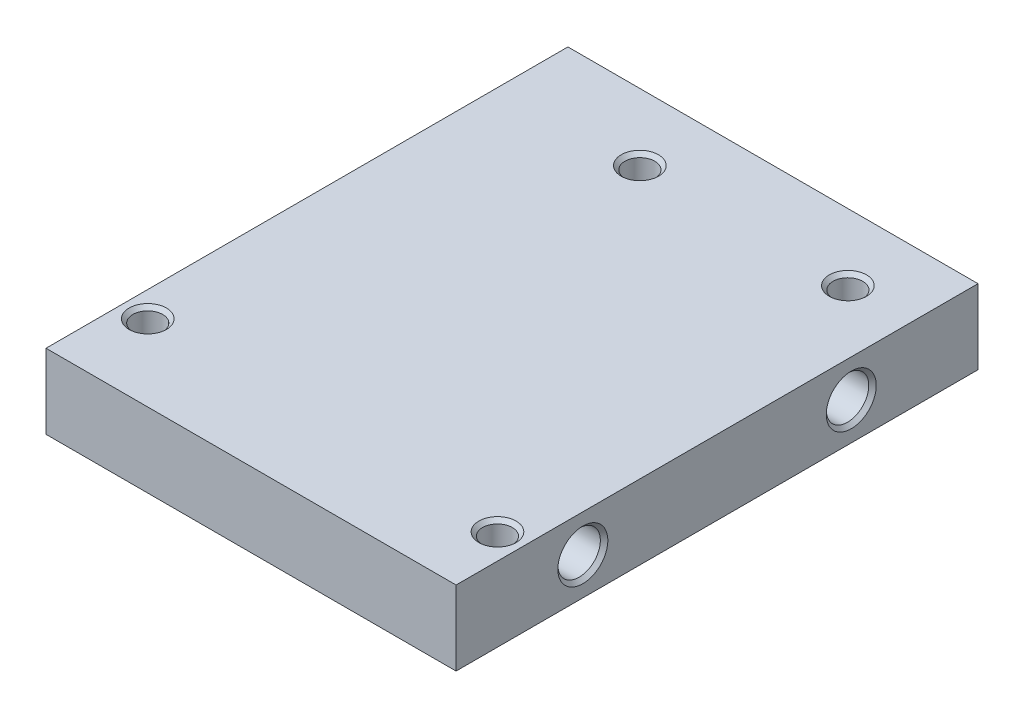
ISO-10303-21;
HEADER;
FILE_DESCRIPTION(('STEP AP214'),'2;1');
FILE_NAME('part.step','',(''),(''),'','','');
FILE_SCHEMA(('AUTOMOTIVE_DESIGN { 1 0 10303 214 1 1 1 1 }'));
ENDSEC;
DATA;
#1=APPLICATION_CONTEXT('core data for automotive mechanical design processes');
#2=APPLICATION_PROTOCOL_DEFINITION('international standard','automotive_design',2000,#1);
#3=PRODUCT_CONTEXT('',#1,'mechanical');
#4=PRODUCT('Part','Part','',(#3));
#5=PRODUCT_RELATED_PRODUCT_CATEGORY('part','',(#4));
#6=PRODUCT_DEFINITION_FORMATION('','',#4);
#7=PRODUCT_DEFINITION_CONTEXT('part definition',#1,'design');
#8=PRODUCT_DEFINITION('design','',#6,#7);
#9=PRODUCT_DEFINITION_SHAPE('','',#8);
#10=(LENGTH_UNIT() NAMED_UNIT(*) SI_UNIT(.MILLI.,.METRE.));
#11=(NAMED_UNIT(*) PLANE_ANGLE_UNIT() SI_UNIT($,.RADIAN.));
#12=(NAMED_UNIT(*) SI_UNIT($,.STERADIAN.) SOLID_ANGLE_UNIT());
#13=UNCERTAINTY_MEASURE_WITH_UNIT(LENGTH_MEASURE(1.E-05),#10,'distance_accuracy_value','');
#14=(GEOMETRIC_REPRESENTATION_CONTEXT(3) GLOBAL_UNCERTAINTY_ASSIGNED_CONTEXT((#13)) GLOBAL_UNIT_ASSIGNED_CONTEXT((#10,
#11,#12)) REPRESENTATION_CONTEXT('',''));
#15=CARTESIAN_POINT('',(0.,0.,0.));
#16=DIRECTION('',(0.,0.,1.));
#17=DIRECTION('',(1.,0.,0.));
#18=AXIS2_PLACEMENT_3D('',#15,#16,#17);
#19=CARTESIAN_POINT('',(0.,5.,0.));
#20=DIRECTION('',(0.,1.,0.));
#21=DIRECTION('',(0.,0.,1.));
#22=AXIS2_PLACEMENT_3D('',#19,#20,#21);
#23=PLANE('',#22);
#24=CARTESIAN_POINT('',(-24.1,5.,24.75));
#25=DIRECTION('',(0.,1.,0.));
#26=DIRECTION('',(0.,0.,1.));
#27=AXIS2_PLACEMENT_3D('',#24,#25,#26);
#28=CIRCLE('',#27,2.5);
#29=CARTESIAN_POINT('',(-24.1,5.,27.25));
#30=VERTEX_POINT('',#29);
#31=EDGE_CURVE('E152',#30,#30,#28,.F.);
#32=ORIENTED_EDGE('',*,*,#31,.T.);
#33=EDGE_LOOP('',(#32));
#34=FACE_BOUND('',#33,.T.);
#35=CARTESIAN_POINT('',(24.1,5.,26.05));
#36=DIRECTION('',(0.,1.,0.));
#37=DIRECTION('',(0.,0.,1.));
#38=AXIS2_PLACEMENT_3D('',#35,#36,#37);
#39=CIRCLE('',#38,2.50000000000001);
#40=CARTESIAN_POINT('',(24.1,5.,28.55));
#41=VERTEX_POINT('',#40);
#42=EDGE_CURVE('E151',#41,#41,#39,.F.);
#43=ORIENTED_EDGE('',*,*,#42,.T.);
#44=EDGE_LOOP('',(#43));
#45=FACE_BOUND('',#44,.T.);
#46=CARTESIAN_POINT('',(19.,5.,-26.05));
#47=DIRECTION('',(0.,1.,0.));
#48=DIRECTION('',(0.,0.,1.));
#49=AXIS2_PLACEMENT_3D('',#46,#47,#48);
#50=CIRCLE('',#49,2.5);
#51=CARTESIAN_POINT('',(19.,5.,-23.55));
#52=VERTEX_POINT('',#51);
#53=EDGE_CURVE('E146',#52,#52,#50,.F.);
#54=ORIENTED_EDGE('',*,*,#53,.T.);
#55=EDGE_LOOP('',(#54));
#56=FACE_BOUND('',#55,.T.);
#57=CARTESIAN_POINT('',(-8.9,5.,-26.05));
#58=DIRECTION('',(0.,1.,0.));
#59=DIRECTION('',(0.,0.,1.));
#60=AXIS2_PLACEMENT_3D('',#57,#58,#59);
#61=CIRCLE('',#60,2.5);
#62=CARTESIAN_POINT('',(-8.9,5.,-23.55));
#63=VERTEX_POINT('',#62);
#64=EDGE_CURVE('E144',#63,#63,#61,.F.);
#65=ORIENTED_EDGE('',*,*,#64,.T.);
#66=EDGE_LOOP('',(#65));
#67=FACE_BOUND('',#66,.T.);
#68=DIRECTION('',(0.,0.,-1.));
#69=VECTOR('',#68,1.);
#70=CARTESIAN_POINT('',(27.5,5.,-35.));
#71=LINE('',#70,#69);
#72=CARTESIAN_POINT('',(27.5,5.,35.));
#73=VERTEX_POINT('',#72);
#74=CARTESIAN_POINT('',(27.5,5.,-35.));
#75=VERTEX_POINT('',#74);
#76=EDGE_CURVE('E91',#73,#75,#71,.T.);
#77=ORIENTED_EDGE('',*,*,#76,.T.);
#78=DIRECTION('',(-1.,0.,0.));
#79=VECTOR('',#78,1.);
#80=CARTESIAN_POINT('',(-27.5,5.,-35.));
#81=LINE('',#80,#79);
#82=CARTESIAN_POINT('',(-27.5,5.,-35.));
#83=VERTEX_POINT('',#82);
#84=EDGE_CURVE('E90',#75,#83,#81,.T.);
#85=ORIENTED_EDGE('',*,*,#84,.T.);
#86=DIRECTION('',(0.,0.,1.));
#87=VECTOR('',#86,1.);
#88=CARTESIAN_POINT('',(-27.5,5.,-35.));
#89=LINE('',#88,#87);
#90=CARTESIAN_POINT('',(-27.5,5.,35.));
#91=VERTEX_POINT('',#90);
#92=EDGE_CURVE('E93',#83,#91,#89,.T.);
#93=ORIENTED_EDGE('',*,*,#92,.T.);
#94=DIRECTION('',(1.,0.,0.));
#95=VECTOR('',#94,1.);
#96=CARTESIAN_POINT('',(-27.5,5.,35.));
#97=LINE('',#96,#95);
#98=EDGE_CURVE('E59',#91,#73,#97,.T.);
#99=ORIENTED_EDGE('',*,*,#98,.T.);
#100=EDGE_LOOP('',(#77,#85,#93,#99));
#101=FACE_BOUND('',#100,.T.);
#102=ADVANCED_FACE('F37',(#34,#45,#56,#67,#101),#23,.T.);
#103=CARTESIAN_POINT('',(0.,-5.,0.));
#104=DIRECTION('',(0.,1.,0.));
#105=DIRECTION('',(0.,0.,1.));
#106=AXIS2_PLACEMENT_3D('',#103,#104,#105);
#107=PLANE('',#106);
#108=DIRECTION('',(0.,0.,-1.));
#109=VECTOR('',#108,1.);
#110=CARTESIAN_POINT('',(27.5,-5.,-35.));
#111=LINE('',#110,#109);
#112=CARTESIAN_POINT('',(27.5,-5.,35.));
#113=VERTEX_POINT('',#112);
#114=CARTESIAN_POINT('',(27.5,-5.,-35.));
#115=VERTEX_POINT('',#114);
#116=EDGE_CURVE('E107',#113,#115,#111,.T.);
#117=ORIENTED_EDGE('',*,*,#116,.F.);
#118=DIRECTION('',(1.,0.,0.));
#119=VECTOR('',#118,1.);
#120=CARTESIAN_POINT('',(-27.5,-5.,35.));
#121=LINE('',#120,#119);
#122=CARTESIAN_POINT('',(-27.5,-5.,35.));
#123=VERTEX_POINT('',#122);
#124=EDGE_CURVE('E81',#123,#113,#121,.T.);
#125=ORIENTED_EDGE('',*,*,#124,.F.);
#126=DIRECTION('',(0.,0.,1.));
#127=VECTOR('',#126,1.);
#128=CARTESIAN_POINT('',(-27.5,-5.,-35.));
#129=LINE('',#128,#127);
#130=CARTESIAN_POINT('',(-27.5,-5.,-35.));
#131=VERTEX_POINT('',#130);
#132=EDGE_CURVE('E73',#131,#123,#129,.T.);
#133=ORIENTED_EDGE('',*,*,#132,.F.);
#134=DIRECTION('',(-1.,0.,0.));
#135=VECTOR('',#134,1.);
#136=CARTESIAN_POINT('',(-27.5,-5.,-35.));
#137=LINE('',#136,#135);
#138=EDGE_CURVE('E98',#115,#131,#137,.T.);
#139=ORIENTED_EDGE('',*,*,#138,.F.);
#140=EDGE_LOOP('',(#117,#125,#133,#139));
#141=FACE_BOUND('',#140,.T.);
#142=CARTESIAN_POINT('',(-24.1,-5.,24.75));
#143=DIRECTION('',(0.,1.,0.));
#144=DIRECTION('',(0.,0.,1.));
#145=AXIS2_PLACEMENT_3D('',#142,#143,#144);
#146=CIRCLE('',#145,2.);
#147=CARTESIAN_POINT('',(-24.1,-5.,26.75));
#148=VERTEX_POINT('',#147);
#149=EDGE_CURVE('E112',#148,#148,#146,.T.);
#150=ORIENTED_EDGE('',*,*,#149,.T.);
#151=EDGE_LOOP('',(#150));
#152=FACE_BOUND('',#151,.T.);
#153=CARTESIAN_POINT('',(19.,-5.,-26.05));
#154=DIRECTION('',(0.,1.,0.));
#155=DIRECTION('',(0.,0.,1.));
#156=AXIS2_PLACEMENT_3D('',#153,#154,#155);
#157=CIRCLE('',#156,2.);
#158=CARTESIAN_POINT('',(19.,-5.,-24.05));
#159=VERTEX_POINT('',#158);
#160=EDGE_CURVE('E256',#159,#159,#157,.T.);
#161=ORIENTED_EDGE('',*,*,#160,.T.);
#162=EDGE_LOOP('',(#161));
#163=FACE_BOUND('',#162,.T.);
#164=CARTESIAN_POINT('',(24.1,-5.,26.05));
#165=DIRECTION('',(0.,1.,0.));
#166=DIRECTION('',(0.,0.,1.));
#167=AXIS2_PLACEMENT_3D('',#164,#165,#166);
#168=CIRCLE('',#167,2.);
#169=CARTESIAN_POINT('',(24.1,-5.,28.05));
#170=VERTEX_POINT('',#169);
#171=EDGE_CURVE('E261',#170,#170,#168,.T.);
#172=ORIENTED_EDGE('',*,*,#171,.T.);
#173=EDGE_LOOP('',(#172));
#174=FACE_BOUND('',#173,.T.);
#175=CARTESIAN_POINT('',(-8.9,-5.,-26.05));
#176=DIRECTION('',(0.,1.,0.));
#177=DIRECTION('',(0.,0.,1.));
#178=AXIS2_PLACEMENT_3D('',#175,#176,#177);
#179=CIRCLE('',#178,2.);
#180=CARTESIAN_POINT('',(-8.9,-5.,-24.05));
#181=VERTEX_POINT('',#180);
#182=EDGE_CURVE('E266',#181,#181,#179,.T.);
#183=ORIENTED_EDGE('',*,*,#182,.T.);
#184=EDGE_LOOP('',(#183));
#185=FACE_BOUND('',#184,.T.);
#186=ADVANCED_FACE('F176',(#141,#152,#163,#174,#185),#107,.F.);
#187=CARTESIAN_POINT('',(27.5,5.,-35.));
#188=DIRECTION('',(-1.,0.,0.));
#189=DIRECTION('',(0.,0.,1.));
#190=AXIS2_PLACEMENT_3D('',#187,#188,#189);
#191=PLANE('',#190);
#192=CARTESIAN_POINT('',(27.5,0.,-18.));
#193=DIRECTION('',(-1.,0.,0.));
#194=DIRECTION('',(0.,0.,1.));
#195=AXIS2_PLACEMENT_3D('',#192,#193,#194);
#196=CIRCLE('',#195,3.34999999999999);
#197=CARTESIAN_POINT('',(27.5,0.,-14.65));
#198=VERTEX_POINT('',#197);
#199=EDGE_CURVE('E136',#198,#198,#196,.T.);
#200=ORIENTED_EDGE('',*,*,#199,.T.);
#201=EDGE_LOOP('',(#200));
#202=FACE_BOUND('',#201,.T.);
#203=CARTESIAN_POINT('',(27.5,0.,18.));
#204=DIRECTION('',(-1.,0.,0.));
#205=DIRECTION('',(0.,0.,1.));
#206=AXIS2_PLACEMENT_3D('',#203,#204,#205);
#207=CIRCLE('',#206,3.34999999999999);
#208=CARTESIAN_POINT('',(27.5,0.,21.35));
#209=VERTEX_POINT('',#208);
#210=EDGE_CURVE('E134',#209,#209,#207,.T.);
#211=ORIENTED_EDGE('',*,*,#210,.T.);
#212=EDGE_LOOP('',(#211));
#213=FACE_BOUND('',#212,.T.);
#214=ORIENTED_EDGE('',*,*,#116,.T.);
#215=DIRECTION('',(0.,-1.,0.));
#216=VECTOR('',#215,1.);
#217=CARTESIAN_POINT('',(27.5,5.,-35.));
#218=LINE('',#217,#216);
#219=EDGE_CURVE('E97',#75,#115,#218,.T.);
#220=ORIENTED_EDGE('',*,*,#219,.F.);
#221=ORIENTED_EDGE('',*,*,#76,.F.);
#222=DIRECTION('',(0.,-1.,0.));
#223=VECTOR('',#222,1.);
#224=CARTESIAN_POINT('',(27.5,5.,35.));
#225=LINE('',#224,#223);
#226=EDGE_CURVE('E102',#73,#113,#225,.T.);
#227=ORIENTED_EDGE('',*,*,#226,.T.);
#228=EDGE_LOOP('',(#214,#220,#221,#227));
#229=FACE_BOUND('',#228,.T.);
#230=ADVANCED_FACE('F189',(#202,#213,#229),#191,.F.);
#231=CARTESIAN_POINT('',(-27.5,5.,-35.));
#232=DIRECTION('',(0.,0.,1.));
#233=DIRECTION('',(1.,0.,0.));
#234=AXIS2_PLACEMENT_3D('',#231,#232,#233);
#235=PLANE('',#234);
#236=ORIENTED_EDGE('',*,*,#138,.T.);
#237=DIRECTION('',(0.,-1.,0.));
#238=VECTOR('',#237,1.);
#239=CARTESIAN_POINT('',(-27.5,5.,-35.));
#240=LINE('',#239,#238);
#241=EDGE_CURVE('E96',#83,#131,#240,.T.);
#242=ORIENTED_EDGE('',*,*,#241,.F.);
#243=ORIENTED_EDGE('',*,*,#84,.F.);
#244=ORIENTED_EDGE('',*,*,#219,.T.);
#245=EDGE_LOOP('',(#236,#242,#243,#244));
#246=FACE_BOUND('',#245,.T.);
#247=ADVANCED_FACE('F100',(#246),#235,.F.);
#248=CARTESIAN_POINT('',(-27.5,5.,-35.));
#249=DIRECTION('',(1.,0.,0.));
#250=DIRECTION('',(0.,0.,-1.));
#251=AXIS2_PLACEMENT_3D('',#248,#249,#250);
#252=PLANE('',#251);
#253=CARTESIAN_POINT('',(-27.5,0.,-18.));
#254=DIRECTION('',(1.,0.,0.));
#255=DIRECTION('',(0.,0.,-1.));
#256=AXIS2_PLACEMENT_3D('',#253,#254,#255);
#257=CIRCLE('',#256,3.35000000000002);
#258=CARTESIAN_POINT('',(-27.5,0.,-21.35));
#259=VERTEX_POINT('',#258);
#260=EDGE_CURVE('E123',#259,#259,#257,.T.);
#261=ORIENTED_EDGE('',*,*,#260,.T.);
#262=EDGE_LOOP('',(#261));
#263=FACE_BOUND('',#262,.T.);
#264=CARTESIAN_POINT('',(-27.5,0.,18.));
#265=DIRECTION('',(1.,0.,0.));
#266=DIRECTION('',(0.,0.,-1.));
#267=AXIS2_PLACEMENT_3D('',#264,#265,#266);
#268=CIRCLE('',#267,3.35000000000003);
#269=CARTESIAN_POINT('',(-27.5,0.,14.65));
#270=VERTEX_POINT('',#269);
#271=EDGE_CURVE('E119',#270,#270,#268,.T.);
#272=ORIENTED_EDGE('',*,*,#271,.T.);
#273=EDGE_LOOP('',(#272));
#274=FACE_BOUND('',#273,.T.);
#275=ORIENTED_EDGE('',*,*,#132,.T.);
#276=DIRECTION('',(0.,-1.,0.));
#277=VECTOR('',#276,1.);
#278=CARTESIAN_POINT('',(-27.5,5.,35.));
#279=LINE('',#278,#277);
#280=EDGE_CURVE('E99',#91,#123,#279,.T.);
#281=ORIENTED_EDGE('',*,*,#280,.F.);
#282=ORIENTED_EDGE('',*,*,#92,.F.);
#283=ORIENTED_EDGE('',*,*,#241,.T.);
#284=EDGE_LOOP('',(#275,#281,#282,#283));
#285=FACE_BOUND('',#284,.T.);
#286=ADVANCED_FACE('F105',(#263,#274,#285),#252,.F.);
#287=CARTESIAN_POINT('',(-27.5,5.,35.));
#288=DIRECTION('',(0.,0.,-1.));
#289=DIRECTION('',(-1.,0.,0.));
#290=AXIS2_PLACEMENT_3D('',#287,#288,#289);
#291=PLANE('',#290);
#292=ORIENTED_EDGE('',*,*,#124,.T.);
#293=ORIENTED_EDGE('',*,*,#226,.F.);
#294=ORIENTED_EDGE('',*,*,#98,.F.);
#295=ORIENTED_EDGE('',*,*,#280,.T.);
#296=EDGE_LOOP('',(#292,#293,#294,#295));
#297=FACE_BOUND('',#296,.T.);
#298=ADVANCED_FACE('F198',(#297),#291,.F.);
#299=CARTESIAN_POINT('',(-24.1,5.,24.75));
#300=DIRECTION('',(0.,-1.,0.));
#301=DIRECTION('',(0.,0.,-1.));
#302=AXIS2_PLACEMENT_3D('',#299,#300,#301);
#303=CYLINDRICAL_SURFACE('',#302,2.);
#304=CARTESIAN_POINT('',(-24.1,4.49999999999999,24.75));
#305=DIRECTION('',(0.,1.,0.));
#306=DIRECTION('',(0.,0.,1.));
#307=AXIS2_PLACEMENT_3D('',#304,#305,#306);
#308=CIRCLE('',#307,2.);
#309=CARTESIAN_POINT('',(-24.1,4.49999999999999,26.75));
#310=VERTEX_POINT('',#309);
#311=EDGE_CURVE('E142',#310,#310,#308,.T.);
#312=ORIENTED_EDGE('',*,*,#311,.T.);
#313=EDGE_LOOP('',(#312));
#314=FACE_BOUND('',#313,.T.);
#315=ORIENTED_EDGE('',*,*,#149,.F.);
#316=EDGE_LOOP('',(#315));
#317=FACE_BOUND('',#316,.T.);
#318=ADVANCED_FACE('F192',(#314,#317),#303,.F.);
#319=CARTESIAN_POINT('',(19.,5.,-26.05));
#320=DIRECTION('',(0.,-1.,0.));
#321=DIRECTION('',(0.,0.,-1.));
#322=AXIS2_PLACEMENT_3D('',#319,#320,#321);
#323=CYLINDRICAL_SURFACE('',#322,2.);
#324=CARTESIAN_POINT('',(19.,4.49999999999999,-26.05));
#325=DIRECTION('',(0.,1.,0.));
#326=DIRECTION('',(0.,0.,1.));
#327=AXIS2_PLACEMENT_3D('',#324,#325,#326);
#328=CIRCLE('',#327,2.);
#329=CARTESIAN_POINT('',(19.,4.49999999999999,-24.05));
#330=VERTEX_POINT('',#329);
#331=EDGE_CURVE('E49',#330,#330,#328,.T.);
#332=ORIENTED_EDGE('',*,*,#331,.T.);
#333=EDGE_LOOP('',(#332));
#334=FACE_BOUND('',#333,.T.);
#335=ORIENTED_EDGE('',*,*,#160,.F.);
#336=EDGE_LOOP('',(#335));
#337=FACE_BOUND('',#336,.T.);
#338=ADVANCED_FACE('F165',(#334,#337),#323,.F.);
#339=CARTESIAN_POINT('',(24.1,5.,26.05));
#340=DIRECTION('',(0.,-1.,0.));
#341=DIRECTION('',(0.,0.,-1.));
#342=AXIS2_PLACEMENT_3D('',#339,#340,#341);
#343=CYLINDRICAL_SURFACE('',#342,2.);
#344=CARTESIAN_POINT('',(24.1,4.49999999999999,26.05));
#345=DIRECTION('',(0.,1.,0.));
#346=DIRECTION('',(0.,0.,1.));
#347=AXIS2_PLACEMENT_3D('',#344,#345,#346);
#348=CIRCLE('',#347,2.);
#349=CARTESIAN_POINT('',(24.1,4.49999999999999,28.05));
#350=VERTEX_POINT('',#349);
#351=EDGE_CURVE('E160',#350,#350,#348,.T.);
#352=ORIENTED_EDGE('',*,*,#351,.T.);
#353=EDGE_LOOP('',(#352));
#354=FACE_BOUND('',#353,.T.);
#355=ORIENTED_EDGE('',*,*,#171,.F.);
#356=EDGE_LOOP('',(#355));
#357=FACE_BOUND('',#356,.T.);
#358=ADVANCED_FACE('F318',(#354,#357),#343,.F.);
#359=CARTESIAN_POINT('',(-8.9,5.,-26.05));
#360=DIRECTION('',(0.,-1.,0.));
#361=DIRECTION('',(0.,0.,-1.));
#362=AXIS2_PLACEMENT_3D('',#359,#360,#361);
#363=CYLINDRICAL_SURFACE('',#362,2.);
#364=CARTESIAN_POINT('',(-8.9,4.49999999999999,-26.05));
#365=DIRECTION('',(0.,1.,0.));
#366=DIRECTION('',(0.,0.,1.));
#367=AXIS2_PLACEMENT_3D('',#364,#365,#366);
#368=CIRCLE('',#367,2.);
#369=CARTESIAN_POINT('',(-8.9,4.49999999999999,-24.05));
#370=VERTEX_POINT('',#369);
#371=EDGE_CURVE('E11',#370,#370,#368,.T.);
#372=ORIENTED_EDGE('',*,*,#371,.T.);
#373=EDGE_LOOP('',(#372));
#374=FACE_BOUND('',#373,.T.);
#375=ORIENTED_EDGE('',*,*,#182,.F.);
#376=EDGE_LOOP('',(#375));
#377=FACE_BOUND('',#376,.T.);
#378=ADVANCED_FACE('F313',(#374,#377),#363,.F.);
#379=CARTESIAN_POINT('',(19.5,0.,-18.));
#380=DIRECTION('',(1.,0.,0.));
#381=DIRECTION('',(0.,0.,-1.));
#382=AXIS2_PLACEMENT_3D('',#379,#380,#381);
#383=CYLINDRICAL_SURFACE('',#382,2.85);
#384=CARTESIAN_POINT('',(27.,0.,-18.));
#385=DIRECTION('',(-1.,0.,0.));
#386=DIRECTION('',(0.,0.,1.));
#387=AXIS2_PLACEMENT_3D('',#384,#385,#386);
#388=CIRCLE('',#387,2.85);
#389=CARTESIAN_POINT('',(27.,0.,-15.15));
#390=VERTEX_POINT('',#389);
#391=EDGE_CURVE('E128',#390,#390,#388,.F.);
#392=ORIENTED_EDGE('',*,*,#391,.T.);
#393=EDGE_LOOP('',(#392));
#394=FACE_BOUND('',#393,.T.);
#395=CARTESIAN_POINT('',(19.5,0.,-18.));
#396=DIRECTION('',(1.,0.,0.));
#397=DIRECTION('',(0.,0.,1.));
#398=AXIS2_PLACEMENT_3D('',#395,#396,#397);
#399=CIRCLE('',#398,2.85);
#400=CARTESIAN_POINT('',(19.5,0.,-15.15));
#401=VERTEX_POINT('',#400);
#402=EDGE_CURVE('E269',#401,#401,#399,.T.);
#403=ORIENTED_EDGE('',*,*,#402,.F.);
#404=EDGE_LOOP('',(#403));
#405=FACE_BOUND('',#404,.T.);
#406=ADVANCED_FACE('F306',(#394,#405),#383,.F.);
#407=CARTESIAN_POINT('',(19.5,0.,-18.));
#408=DIRECTION('',(-1.,0.,0.));
#409=DIRECTION('',(0.,0.,1.));
#410=AXIS2_PLACEMENT_3D('',#407,#408,#409);
#411=PLANE('',#410);
#412=ORIENTED_EDGE('',*,*,#402,.T.);
#413=EDGE_LOOP('',(#412));
#414=FACE_BOUND('',#413,.T.);
#415=ADVANCED_FACE('F308',(#414),#411,.F.);
#416=CARTESIAN_POINT('',(19.5,0.,18.));
#417=DIRECTION('',(1.,0.,0.));
#418=DIRECTION('',(0.,0.,-1.));
#419=AXIS2_PLACEMENT_3D('',#416,#417,#418);
#420=CYLINDRICAL_SURFACE('',#419,2.85);
#421=CARTESIAN_POINT('',(27.,0.,18.));
#422=DIRECTION('',(-1.,0.,0.));
#423=DIRECTION('',(0.,0.,1.));
#424=AXIS2_PLACEMENT_3D('',#421,#422,#423);
#425=CIRCLE('',#424,2.85);
#426=CARTESIAN_POINT('',(27.,0.,20.85));
#427=VERTEX_POINT('',#426);
#428=EDGE_CURVE('E138',#427,#427,#425,.F.);
#429=ORIENTED_EDGE('',*,*,#428,.T.);
#430=EDGE_LOOP('',(#429));
#431=FACE_BOUND('',#430,.T.);
#432=CARTESIAN_POINT('',(19.5,0.,18.));
#433=DIRECTION('',(1.,0.,0.));
#434=DIRECTION('',(0.,0.,-1.));
#435=AXIS2_PLACEMENT_3D('',#432,#433,#434);
#436=CIRCLE('',#435,2.85);
#437=CARTESIAN_POINT('',(19.5,0.,15.15));
#438=VERTEX_POINT('',#437);
#439=EDGE_CURVE('E267',#438,#438,#436,.T.);
#440=ORIENTED_EDGE('',*,*,#439,.F.);
#441=EDGE_LOOP('',(#440));
#442=FACE_BOUND('',#441,.T.);
#443=ADVANCED_FACE('F305',(#431,#442),#420,.F.);
#444=CARTESIAN_POINT('',(19.5,0.,18.));
#445=DIRECTION('',(1.,0.,0.));
#446=DIRECTION('',(0.,0.,-1.));
#447=AXIS2_PLACEMENT_3D('',#444,#445,#446);
#448=PLANE('',#447);
#449=ORIENTED_EDGE('',*,*,#439,.T.);
#450=EDGE_LOOP('',(#449));
#451=FACE_BOUND('',#450,.T.);
#452=ADVANCED_FACE('F299',(#451),#448,.T.);
#453=CARTESIAN_POINT('',(-19.5,0.,-18.));
#454=DIRECTION('',(-1.,0.,0.));
#455=DIRECTION('',(0.,0.,1.));
#456=AXIS2_PLACEMENT_3D('',#453,#454,#455);
#457=CYLINDRICAL_SURFACE('',#456,2.85);
#458=CARTESIAN_POINT('',(-27.,0.,-18.));
#459=DIRECTION('',(1.,0.,0.));
#460=DIRECTION('',(0.,0.,-1.));
#461=AXIS2_PLACEMENT_3D('',#458,#459,#460);
#462=CIRCLE('',#461,2.85);
#463=CARTESIAN_POINT('',(-27.,0.,-20.85));
#464=VERTEX_POINT('',#463);
#465=EDGE_CURVE('E125',#464,#464,#462,.F.);
#466=ORIENTED_EDGE('',*,*,#465,.T.);
#467=EDGE_LOOP('',(#466));
#468=FACE_BOUND('',#467,.T.);
#469=CARTESIAN_POINT('',(-19.5,0.,-18.));
#470=DIRECTION('',(1.,0.,0.));
#471=DIRECTION('',(0.,0.,1.));
#472=AXIS2_PLACEMENT_3D('',#469,#470,#471);
#473=CIRCLE('',#472,2.85);
#474=CARTESIAN_POINT('',(-19.5,0.,-15.15));
#475=VERTEX_POINT('',#474);
#476=EDGE_CURVE('E277',#475,#475,#473,.T.);
#477=ORIENTED_EDGE('',*,*,#476,.T.);
#478=EDGE_LOOP('',(#477));
#479=FACE_BOUND('',#478,.T.);
#480=ADVANCED_FACE('F294',(#468,#479),#457,.F.);
#481=CARTESIAN_POINT('',(-19.5,0.,-18.));
#482=DIRECTION('',(1.,0.,0.));
#483=DIRECTION('',(0.,0.,1.));
#484=AXIS2_PLACEMENT_3D('',#481,#482,#483);
#485=PLANE('',#484);
#486=ORIENTED_EDGE('',*,*,#476,.F.);
#487=EDGE_LOOP('',(#486));
#488=FACE_BOUND('',#487,.T.);
#489=ADVANCED_FACE('F290',(#488),#485,.F.);
#490=CARTESIAN_POINT('',(-19.5,0.,18.));
#491=DIRECTION('',(-1.,0.,0.));
#492=DIRECTION('',(0.,0.,1.));
#493=AXIS2_PLACEMENT_3D('',#490,#491,#492);
#494=CYLINDRICAL_SURFACE('',#493,2.85);
#495=CARTESIAN_POINT('',(-27.,0.,18.));
#496=DIRECTION('',(1.,0.,0.));
#497=DIRECTION('',(0.,0.,-1.));
#498=AXIS2_PLACEMENT_3D('',#495,#496,#497);
#499=CIRCLE('',#498,2.85);
#500=CARTESIAN_POINT('',(-27.,0.,15.15));
#501=VERTEX_POINT('',#500);
#502=EDGE_CURVE('E130',#501,#501,#499,.F.);
#503=ORIENTED_EDGE('',*,*,#502,.T.);
#504=EDGE_LOOP('',(#503));
#505=FACE_BOUND('',#504,.T.);
#506=CARTESIAN_POINT('',(-19.5,0.,18.));
#507=DIRECTION('',(1.,0.,0.));
#508=DIRECTION('',(0.,0.,-1.));
#509=AXIS2_PLACEMENT_3D('',#506,#507,#508);
#510=CIRCLE('',#509,2.85);
#511=CARTESIAN_POINT('',(-19.5,0.,15.15));
#512=VERTEX_POINT('',#511);
#513=EDGE_CURVE('E272',#512,#512,#510,.T.);
#514=ORIENTED_EDGE('',*,*,#513,.T.);
#515=EDGE_LOOP('',(#514));
#516=FACE_BOUND('',#515,.T.);
#517=ADVANCED_FACE('F285',(#505,#516),#494,.F.);
#518=CARTESIAN_POINT('',(-19.5,0.,18.));
#519=DIRECTION('',(-1.,0.,0.));
#520=DIRECTION('',(0.,0.,-1.));
#521=AXIS2_PLACEMENT_3D('',#518,#519,#520);
#522=PLANE('',#521);
#523=ORIENTED_EDGE('',*,*,#513,.F.);
#524=EDGE_LOOP('',(#523));
#525=FACE_BOUND('',#524,.T.);
#526=ADVANCED_FACE('F212',(#525),#522,.T.);
#527=CARTESIAN_POINT('',(-27.5,0.,-18.));
#528=DIRECTION('',(-1.,0.,0.));
#529=DIRECTION('',(0.,0.,1.));
#530=AXIS2_PLACEMENT_3D('',#527,#528,#529);
#531=CONICAL_SURFACE('',#530,3.35000000000002,0.785398163397451);
#532=ORIENTED_EDGE('',*,*,#465,.F.);
#533=EDGE_LOOP('',(#532));
#534=FACE_BOUND('',#533,.T.);
#535=ORIENTED_EDGE('',*,*,#260,.F.);
#536=EDGE_LOOP('',(#535));
#537=FACE_BOUND('',#536,.T.);
#538=ADVANCED_FACE('F210',(#534,#537),#531,.F.);
#539=CARTESIAN_POINT('',(-27.5,0.,18.));
#540=DIRECTION('',(-1.,0.,0.));
#541=DIRECTION('',(0.,0.,1.));
#542=AXIS2_PLACEMENT_3D('',#539,#540,#541);
#543=CONICAL_SURFACE('',#542,3.35000000000003,0.785398163397451);
#544=ORIENTED_EDGE('',*,*,#502,.F.);
#545=EDGE_LOOP('',(#544));
#546=FACE_BOUND('',#545,.T.);
#547=ORIENTED_EDGE('',*,*,#271,.F.);
#548=EDGE_LOOP('',(#547));
#549=FACE_BOUND('',#548,.T.);
#550=ADVANCED_FACE('F213',(#546,#549),#543,.F.);
#551=CARTESIAN_POINT('',(27.,0.,-18.));
#552=DIRECTION('',(1.,0.,0.));
#553=DIRECTION('',(0.,0.,-1.));
#554=AXIS2_PLACEMENT_3D('',#551,#552,#553);
#555=CONICAL_SURFACE('',#554,2.85,0.785398163397447);
#556=ORIENTED_EDGE('',*,*,#199,.F.);
#557=EDGE_LOOP('',(#556));
#558=FACE_BOUND('',#557,.T.);
#559=ORIENTED_EDGE('',*,*,#391,.F.);
#560=EDGE_LOOP('',(#559));
#561=FACE_BOUND('',#560,.T.);
#562=ADVANCED_FACE('F222',(#558,#561),#555,.F.);
#563=CARTESIAN_POINT('',(27.,0.,18.));
#564=DIRECTION('',(1.,0.,0.));
#565=DIRECTION('',(0.,0.,-1.));
#566=AXIS2_PLACEMENT_3D('',#563,#564,#565);
#567=CONICAL_SURFACE('',#566,2.85,0.785398163397447);
#568=ORIENTED_EDGE('',*,*,#210,.F.);
#569=EDGE_LOOP('',(#568));
#570=FACE_BOUND('',#569,.T.);
#571=ORIENTED_EDGE('',*,*,#428,.F.);
#572=EDGE_LOOP('',(#571));
#573=FACE_BOUND('',#572,.T.);
#574=ADVANCED_FACE('F229',(#570,#573),#567,.F.);
#575=CARTESIAN_POINT('',(-24.1,4.49999999999999,24.75));
#576=DIRECTION('',(0.,1.,0.));
#577=DIRECTION('',(0.,0.,1.));
#578=AXIS2_PLACEMENT_3D('',#575,#576,#577);
#579=CONICAL_SURFACE('',#578,2.,0.785398163397441);
#580=ORIENTED_EDGE('',*,*,#31,.F.);
#581=EDGE_LOOP('',(#580));
#582=FACE_BOUND('',#581,.T.);
#583=ORIENTED_EDGE('',*,*,#311,.F.);
#584=EDGE_LOOP('',(#583));
#585=FACE_BOUND('',#584,.T.);
#586=ADVANCED_FACE('F171',(#582,#585),#579,.F.);
#587=CARTESIAN_POINT('',(24.1,4.49999999999999,26.05));
#588=DIRECTION('',(0.,1.,0.));
#589=DIRECTION('',(0.,0.,1.));
#590=AXIS2_PLACEMENT_3D('',#587,#588,#589);
#591=CONICAL_SURFACE('',#590,2.,0.785398163397445);
#592=ORIENTED_EDGE('',*,*,#42,.F.);
#593=EDGE_LOOP('',(#592));
#594=FACE_BOUND('',#593,.T.);
#595=ORIENTED_EDGE('',*,*,#351,.F.);
#596=EDGE_LOOP('',(#595));
#597=FACE_BOUND('',#596,.T.);
#598=ADVANCED_FACE('F170',(#594,#597),#591,.F.);
#599=CARTESIAN_POINT('',(19.,4.49999999999999,-26.05));
#600=DIRECTION('',(0.,1.,0.));
#601=DIRECTION('',(0.,0.,1.));
#602=AXIS2_PLACEMENT_3D('',#599,#600,#601);
#603=CONICAL_SURFACE('',#602,2.,0.785398163397441);
#604=ORIENTED_EDGE('',*,*,#53,.F.);
#605=EDGE_LOOP('',(#604));
#606=FACE_BOUND('',#605,.T.);
#607=ORIENTED_EDGE('',*,*,#331,.F.);
#608=EDGE_LOOP('',(#607));
#609=FACE_BOUND('',#608,.T.);
#610=ADVANCED_FACE('F164',(#606,#609),#603,.F.);
#611=CARTESIAN_POINT('',(-8.9,4.49999999999999,-26.05));
#612=DIRECTION('',(0.,1.,0.));
#613=DIRECTION('',(0.,0.,1.));
#614=AXIS2_PLACEMENT_3D('',#611,#612,#613);
#615=CONICAL_SURFACE('',#614,2.,0.785398163397441);
#616=ORIENTED_EDGE('',*,*,#64,.F.);
#617=EDGE_LOOP('',(#616));
#618=FACE_BOUND('',#617,.T.);
#619=ORIENTED_EDGE('',*,*,#371,.F.);
#620=EDGE_LOOP('',(#619));
#621=FACE_BOUND('',#620,.T.);
#622=ADVANCED_FACE('F43',(#618,#621),#615,.F.);
#623=CLOSED_SHELL('',(#102,#186,#230,#247,#286,#298,#318,#338,#358,#378,#406,#415,#443,#452,
#480,#489,#517,#526,#538,#550,#562,#574,#586,#598,#610,#622));
#624=MANIFOLD_SOLID_BREP('B2',#623);
#625=ADVANCED_BREP_SHAPE_REPRESENTATION('',(#18,#624),#14);
#626=SHAPE_DEFINITION_REPRESENTATION(#9,#625);
ENDSEC;
END-ISO-10303-21;
